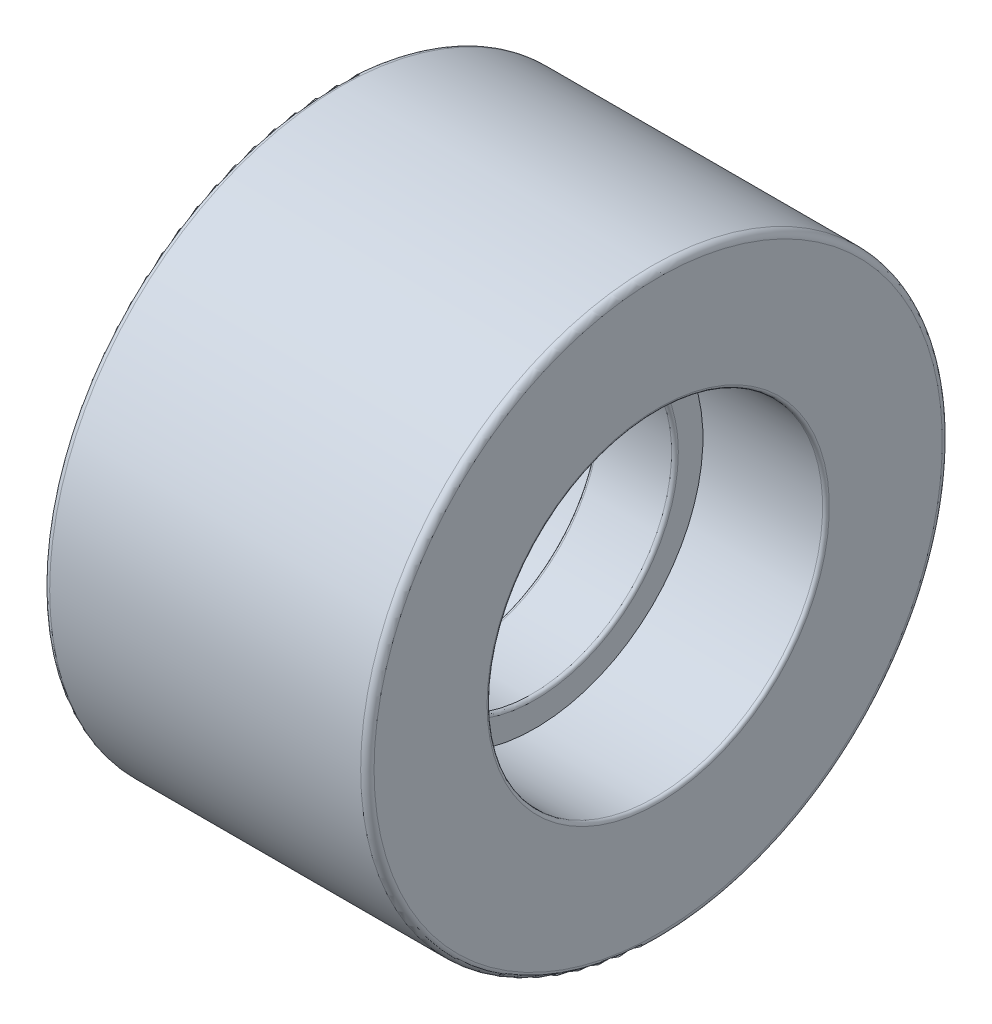
ISO-10303-21;
HEADER;
FILE_DESCRIPTION(('STEP AP214'),'2;1');
FILE_NAME('part.step','',(''),(''),'','','');
FILE_SCHEMA(('AUTOMOTIVE_DESIGN { 1 0 10303 214 1 1 1 1 }'));
ENDSEC;
DATA;
#1=APPLICATION_CONTEXT('core data for automotive mechanical design processes');
#2=APPLICATION_PROTOCOL_DEFINITION('international standard','automotive_design',2000,#1);
#3=PRODUCT_CONTEXT('',#1,'mechanical');
#4=PRODUCT('Part','Part','',(#3));
#5=PRODUCT_RELATED_PRODUCT_CATEGORY('part','',(#4));
#6=PRODUCT_DEFINITION_FORMATION('','',#4);
#7=PRODUCT_DEFINITION_CONTEXT('part definition',#1,'design');
#8=PRODUCT_DEFINITION('design','',#6,#7);
#9=PRODUCT_DEFINITION_SHAPE('','',#8);
#10=(LENGTH_UNIT() NAMED_UNIT(*) SI_UNIT(.MILLI.,.METRE.));
#11=(NAMED_UNIT(*) PLANE_ANGLE_UNIT() SI_UNIT($,.RADIAN.));
#12=(NAMED_UNIT(*) SI_UNIT($,.STERADIAN.) SOLID_ANGLE_UNIT());
#13=UNCERTAINTY_MEASURE_WITH_UNIT(LENGTH_MEASURE(1.E-05),#10,'distance_accuracy_value','');
#14=(GEOMETRIC_REPRESENTATION_CONTEXT(3) GLOBAL_UNCERTAINTY_ASSIGNED_CONTEXT((#13)) GLOBAL_UNIT_ASSIGNED_CONTEXT((#10,
#11,#12)) REPRESENTATION_CONTEXT('',''));
#15=CARTESIAN_POINT('',(0.,0.,0.));
#16=DIRECTION('',(0.,0.,1.));
#17=DIRECTION('',(1.,0.,0.));
#18=AXIS2_PLACEMENT_3D('',#15,#16,#17);
#19=CARTESIAN_POINT('',(0.,15.3,0.));
#20=DIRECTION('',(-1.,0.,0.));
#21=DIRECTION('',(0.,0.,1.));
#22=AXIS2_PLACEMENT_3D('',#19,#20,#21);
#23=PLANE('',#22);
#24=CARTESIAN_POINT('',(0.,0.,0.));
#25=DIRECTION('',(-1.,0.,0.));
#26=DIRECTION('',(0.,0.,1.));
#27=AXIS2_PLACEMENT_3D('',#24,#25,#26);
#28=CIRCLE('',#27,25.4);
#29=CARTESIAN_POINT('',(0.,0.,25.4));
#30=VERTEX_POINT('',#29);
#31=EDGE_CURVE('E127',#30,#30,#28,.T.);
#32=ORIENTED_EDGE('',*,*,#31,.T.);
#33=EDGE_LOOP('',(#32));
#34=FACE_BOUND('',#33,.T.);
#35=CARTESIAN_POINT('',(0.,0.,0.));
#36=DIRECTION('',(-1.,0.,0.));
#37=DIRECTION('',(0.,0.,1.));
#38=AXIS2_PLACEMENT_3D('',#35,#36,#37);
#39=CIRCLE('',#38,15.3);
#40=CARTESIAN_POINT('',(0.,0.,15.3));
#41=VERTEX_POINT('',#40);
#42=EDGE_CURVE('E10',#41,#41,#39,.T.);
#43=ORIENTED_EDGE('',*,*,#42,.F.);
#44=EDGE_LOOP('',(#43));
#45=FACE_BOUND('',#44,.T.);
#46=ADVANCED_FACE('F15',(#34,#45),#23,.T.);
#47=CARTESIAN_POINT('',(0.3,0.,0.));
#48=DIRECTION('',(-1.,0.,0.));
#49=DIRECTION('',(0.,0.,1.));
#50=AXIS2_PLACEMENT_3D('',#47,#48,#49);
#51=TOROIDAL_SURFACE('',#50,15.3,0.3);
#52=CARTESIAN_POINT('',(0.3,0.,0.));
#53=DIRECTION('',(-1.,0.,0.));
#54=DIRECTION('',(0.,0.,1.));
#55=AXIS2_PLACEMENT_3D('',#52,#53,#54);
#56=CIRCLE('',#55,15.);
#57=CARTESIAN_POINT('',(0.3,0.,15.));
#58=VERTEX_POINT('',#57);
#59=EDGE_CURVE('E24',#58,#58,#56,.T.);
#60=ORIENTED_EDGE('',*,*,#59,.F.);
#61=EDGE_LOOP('',(#60));
#62=FACE_BOUND('',#61,.T.);
#63=ORIENTED_EDGE('',*,*,#42,.T.);
#64=EDGE_LOOP('',(#63));
#65=FACE_BOUND('',#64,.T.);
#66=ADVANCED_FACE('F180',(#62,#65),#51,.T.);
#67=CARTESIAN_POINT('',(0.3,0.,0.));
#68=DIRECTION('',(-1.,0.,0.));
#69=DIRECTION('',(0.,0.,1.));
#70=AXIS2_PLACEMENT_3D('',#67,#68,#69);
#71=CYLINDRICAL_SURFACE('',#70,15.);
#72=CARTESIAN_POINT('',(11.,0.,0.));
#73=DIRECTION('',(-1.,0.,0.));
#74=DIRECTION('',(0.,0.,1.));
#75=AXIS2_PLACEMENT_3D('',#72,#73,#74);
#76=CIRCLE('',#75,15.);
#77=CARTESIAN_POINT('',(11.,0.,15.));
#78=VERTEX_POINT('',#77);
#79=EDGE_CURVE('E32',#78,#78,#76,.T.);
#80=ORIENTED_EDGE('',*,*,#79,.F.);
#81=EDGE_LOOP('',(#80));
#82=FACE_BOUND('',#81,.T.);
#83=ORIENTED_EDGE('',*,*,#59,.T.);
#84=EDGE_LOOP('',(#83));
#85=FACE_BOUND('',#84,.T.);
#86=ADVANCED_FACE('F177',(#82,#85),#71,.F.);
#87=CARTESIAN_POINT('',(11.,15.,0.));
#88=DIRECTION('',(1.,0.,0.));
#89=DIRECTION('',(0.,0.,-1.));
#90=AXIS2_PLACEMENT_3D('',#87,#88,#89);
#91=PLANE('',#90);
#92=CARTESIAN_POINT('',(11.,0.,0.));
#93=DIRECTION('',(-1.,0.,0.));
#94=DIRECTION('',(0.,0.,1.));
#95=AXIS2_PLACEMENT_3D('',#92,#93,#94);
#96=CIRCLE('',#95,12.8);
#97=CARTESIAN_POINT('',(11.,0.,12.8));
#98=VERTEX_POINT('',#97);
#99=EDGE_CURVE('E167',#98,#98,#96,.T.);
#100=ORIENTED_EDGE('',*,*,#99,.F.);
#101=EDGE_LOOP('',(#100));
#102=FACE_BOUND('',#101,.T.);
#103=ORIENTED_EDGE('',*,*,#79,.T.);
#104=EDGE_LOOP('',(#103));
#105=FACE_BOUND('',#104,.T.);
#106=ADVANCED_FACE('F175',(#102,#105),#91,.F.);
#107=CARTESIAN_POINT('',(11.3,0.,0.));
#108=DIRECTION('',(-1.,0.,0.));
#109=DIRECTION('',(0.,0.,1.));
#110=AXIS2_PLACEMENT_3D('',#107,#108,#109);
#111=TOROIDAL_SURFACE('',#110,12.8,0.3);
#112=CARTESIAN_POINT('',(11.3,0.,0.));
#113=DIRECTION('',(-1.,0.,0.));
#114=DIRECTION('',(0.,0.,1.));
#115=AXIS2_PLACEMENT_3D('',#112,#113,#114);
#116=CIRCLE('',#115,12.5);
#117=CARTESIAN_POINT('',(11.3,0.,12.5));
#118=VERTEX_POINT('',#117);
#119=EDGE_CURVE('E163',#118,#118,#116,.T.);
#120=ORIENTED_EDGE('',*,*,#119,.F.);
#121=EDGE_LOOP('',(#120));
#122=FACE_BOUND('',#121,.T.);
#123=ORIENTED_EDGE('',*,*,#99,.T.);
#124=EDGE_LOOP('',(#123));
#125=FACE_BOUND('',#124,.T.);
#126=ADVANCED_FACE('F193',(#122,#125),#111,.T.);
#127=CARTESIAN_POINT('',(0.3,0.,0.));
#128=DIRECTION('',(-1.,0.,0.));
#129=DIRECTION('',(0.,0.,1.));
#130=AXIS2_PLACEMENT_3D('',#127,#128,#129);
#131=CYLINDRICAL_SURFACE('',#130,12.5);
#132=CARTESIAN_POINT('',(17.7,0.,0.));
#133=DIRECTION('',(-1.,0.,0.));
#134=DIRECTION('',(0.,0.,1.));
#135=AXIS2_PLACEMENT_3D('',#132,#133,#134);
#136=CIRCLE('',#135,12.5);
#137=CARTESIAN_POINT('',(17.7,0.,12.5));
#138=VERTEX_POINT('',#137);
#139=EDGE_CURVE('E159',#138,#138,#136,.T.);
#140=ORIENTED_EDGE('',*,*,#139,.F.);
#141=EDGE_LOOP('',(#140));
#142=FACE_BOUND('',#141,.T.);
#143=ORIENTED_EDGE('',*,*,#119,.T.);
#144=EDGE_LOOP('',(#143));
#145=FACE_BOUND('',#144,.T.);
#146=ADVANCED_FACE('F197',(#142,#145),#131,.F.);
#147=CARTESIAN_POINT('',(17.7,0.,0.));
#148=DIRECTION('',(-1.,0.,0.));
#149=DIRECTION('',(0.,0.,1.));
#150=AXIS2_PLACEMENT_3D('',#147,#148,#149);
#151=TOROIDAL_SURFACE('',#150,12.8,0.3);
#152=CARTESIAN_POINT('',(18.,0.,0.));
#153=DIRECTION('',(-1.,0.,0.));
#154=DIRECTION('',(0.,0.,1.));
#155=AXIS2_PLACEMENT_3D('',#152,#153,#154);
#156=CIRCLE('',#155,12.8);
#157=CARTESIAN_POINT('',(18.,0.,12.8));
#158=VERTEX_POINT('',#157);
#159=EDGE_CURVE('E155',#158,#158,#156,.T.);
#160=ORIENTED_EDGE('',*,*,#159,.F.);
#161=EDGE_LOOP('',(#160));
#162=FACE_BOUND('',#161,.T.);
#163=ORIENTED_EDGE('',*,*,#139,.T.);
#164=EDGE_LOOP('',(#163));
#165=FACE_BOUND('',#164,.T.);
#166=ADVANCED_FACE('F201',(#162,#165),#151,.T.);
#167=CARTESIAN_POINT('',(18.,12.8,0.));
#168=DIRECTION('',(-1.,0.,0.));
#169=DIRECTION('',(0.,0.,1.));
#170=AXIS2_PLACEMENT_3D('',#167,#168,#169);
#171=PLANE('',#170);
#172=CARTESIAN_POINT('',(18.,0.,0.));
#173=DIRECTION('',(-1.,0.,0.));
#174=DIRECTION('',(0.,0.,1.));
#175=AXIS2_PLACEMENT_3D('',#172,#173,#174);
#176=CIRCLE('',#175,15.);
#177=CARTESIAN_POINT('',(18.,0.,15.));
#178=VERTEX_POINT('',#177);
#179=EDGE_CURVE('E151',#178,#178,#176,.T.);
#180=ORIENTED_EDGE('',*,*,#179,.F.);
#181=EDGE_LOOP('',(#180));
#182=FACE_BOUND('',#181,.T.);
#183=ORIENTED_EDGE('',*,*,#159,.T.);
#184=EDGE_LOOP('',(#183));
#185=FACE_BOUND('',#184,.T.);
#186=ADVANCED_FACE('F205',(#182,#185),#171,.F.);
#187=CARTESIAN_POINT('',(0.3,0.,0.));
#188=DIRECTION('',(-1.,0.,0.));
#189=DIRECTION('',(0.,0.,1.));
#190=AXIS2_PLACEMENT_3D('',#187,#188,#189);
#191=CYLINDRICAL_SURFACE('',#190,15.);
#192=CARTESIAN_POINT('',(28.7,0.,0.));
#193=DIRECTION('',(-1.,0.,0.));
#194=DIRECTION('',(0.,0.,1.));
#195=AXIS2_PLACEMENT_3D('',#192,#193,#194);
#196=CIRCLE('',#195,15.);
#197=CARTESIAN_POINT('',(28.7,0.,15.));
#198=VERTEX_POINT('',#197);
#199=EDGE_CURVE('E147',#198,#198,#196,.T.);
#200=ORIENTED_EDGE('',*,*,#199,.F.);
#201=EDGE_LOOP('',(#200));
#202=FACE_BOUND('',#201,.T.);
#203=ORIENTED_EDGE('',*,*,#179,.T.);
#204=EDGE_LOOP('',(#203));
#205=FACE_BOUND('',#204,.T.);
#206=ADVANCED_FACE('F209',(#202,#205),#191,.F.);
#207=CARTESIAN_POINT('',(28.7,0.,0.));
#208=DIRECTION('',(-1.,0.,0.));
#209=DIRECTION('',(0.,0.,1.));
#210=AXIS2_PLACEMENT_3D('',#207,#208,#209);
#211=TOROIDAL_SURFACE('',#210,15.3,0.3);
#212=CARTESIAN_POINT('',(29.,0.,0.));
#213=DIRECTION('',(-1.,0.,0.));
#214=DIRECTION('',(0.,0.,1.));
#215=AXIS2_PLACEMENT_3D('',#212,#213,#214);
#216=CIRCLE('',#215,15.3);
#217=CARTESIAN_POINT('',(29.,0.,15.3));
#218=VERTEX_POINT('',#217);
#219=EDGE_CURVE('E143',#218,#218,#216,.T.);
#220=ORIENTED_EDGE('',*,*,#219,.F.);
#221=EDGE_LOOP('',(#220));
#222=FACE_BOUND('',#221,.T.);
#223=ORIENTED_EDGE('',*,*,#199,.T.);
#224=EDGE_LOOP('',(#223));
#225=FACE_BOUND('',#224,.T.);
#226=ADVANCED_FACE('F213',(#222,#225),#211,.T.);
#227=CARTESIAN_POINT('',(29.,15.3,0.));
#228=DIRECTION('',(-1.,0.,0.));
#229=DIRECTION('',(0.,0.,1.));
#230=AXIS2_PLACEMENT_3D('',#227,#228,#229);
#231=PLANE('',#230);
#232=CARTESIAN_POINT('',(29.,0.,0.));
#233=DIRECTION('',(-1.,0.,0.));
#234=DIRECTION('',(0.,0.,1.));
#235=AXIS2_PLACEMENT_3D('',#232,#233,#234);
#236=CIRCLE('',#235,25.4);
#237=CARTESIAN_POINT('',(29.,0.,25.4));
#238=VERTEX_POINT('',#237);
#239=EDGE_CURVE('E139',#238,#238,#236,.T.);
#240=ORIENTED_EDGE('',*,*,#239,.F.);
#241=EDGE_LOOP('',(#240));
#242=FACE_BOUND('',#241,.T.);
#243=ORIENTED_EDGE('',*,*,#219,.T.);
#244=EDGE_LOOP('',(#243));
#245=FACE_BOUND('',#244,.T.);
#246=ADVANCED_FACE('F217',(#242,#245),#231,.F.);
#247=CARTESIAN_POINT('',(28.4,0.,0.));
#248=DIRECTION('',(-1.,0.,0.));
#249=DIRECTION('',(0.,0.,1.));
#250=AXIS2_PLACEMENT_3D('',#247,#248,#249);
#251=TOROIDAL_SURFACE('',#250,25.4,0.6);
#252=CARTESIAN_POINT('',(28.4,0.,0.));
#253=DIRECTION('',(-1.,0.,0.));
#254=DIRECTION('',(0.,0.,1.));
#255=AXIS2_PLACEMENT_3D('',#252,#253,#254);
#256=CIRCLE('',#255,26.);
#257=CARTESIAN_POINT('',(28.4,0.,26.));
#258=VERTEX_POINT('',#257);
#259=EDGE_CURVE('E135',#258,#258,#256,.T.);
#260=ORIENTED_EDGE('',*,*,#259,.F.);
#261=EDGE_LOOP('',(#260));
#262=FACE_BOUND('',#261,.T.);
#263=ORIENTED_EDGE('',*,*,#239,.T.);
#264=EDGE_LOOP('',(#263));
#265=FACE_BOUND('',#264,.T.);
#266=ADVANCED_FACE('F221',(#262,#265),#251,.T.);
#267=CARTESIAN_POINT('',(0.3,0.,0.));
#268=DIRECTION('',(-1.,0.,0.));
#269=DIRECTION('',(0.,0.,1.));
#270=AXIS2_PLACEMENT_3D('',#267,#268,#269);
#271=CYLINDRICAL_SURFACE('',#270,26.);
#272=ORIENTED_EDGE('',*,*,#259,.T.);
#273=EDGE_LOOP('',(#272));
#274=FACE_BOUND('',#273,.T.);
#275=CARTESIAN_POINT('',(0.6,0.,0.));
#276=DIRECTION('',(-1.,0.,0.));
#277=DIRECTION('',(0.,0.,1.));
#278=AXIS2_PLACEMENT_3D('',#275,#276,#277);
#279=CIRCLE('',#278,26.);
#280=CARTESIAN_POINT('',(0.6,0.,26.));
#281=VERTEX_POINT('',#280);
#282=EDGE_CURVE('E131',#281,#281,#279,.T.);
#283=ORIENTED_EDGE('',*,*,#282,.F.);
#284=EDGE_LOOP('',(#283));
#285=FACE_BOUND('',#284,.T.);
#286=ADVANCED_FACE('F225',(#274,#285),#271,.T.);
#287=CARTESIAN_POINT('',(0.6,0.,0.));
#288=DIRECTION('',(-1.,0.,0.));
#289=DIRECTION('',(0.,0.,1.));
#290=AXIS2_PLACEMENT_3D('',#287,#288,#289);
#291=TOROIDAL_SURFACE('',#290,25.4,0.6);
#292=ORIENTED_EDGE('',*,*,#31,.F.);
#293=EDGE_LOOP('',(#292));
#294=FACE_BOUND('',#293,.T.);
#295=ORIENTED_EDGE('',*,*,#282,.T.);
#296=EDGE_LOOP('',(#295));
#297=FACE_BOUND('',#296,.T.);
#298=ADVANCED_FACE('F229',(#294,#297),#291,.T.);
#299=CLOSED_SHELL('',(#46,#66,#86,#106,#126,#146,#166,#186,#206,#226,#246,#266,#286,#298));
#300=CARTESIAN_POINT('',(5.852,0.,0.));
#301=DIRECTION('',(-1.,0.,0.));
#302=DIRECTION('',(0.,0.,-1.));
#303=AXIS2_PLACEMENT_3D('',#300,#301,#302);
#304=CYLINDRICAL_SURFACE('',#303,20.23);
#305=CARTESIAN_POINT('',(7.562,0.,0.));
#306=DIRECTION('',(-1.,0.,0.));
#307=DIRECTION('',(0.,-1.,0.));
#308=AXIS2_PLACEMENT_3D('',#305,#306,#307);
#309=CIRCLE('',#308,20.23);
#310=CARTESIAN_POINT('',(7.562,-20.23,0.));
#311=VERTEX_POINT('',#310);
#312=EDGE_CURVE('E45',#311,#311,#309,.T.);
#313=ORIENTED_EDGE('',*,*,#312,.T.);
#314=EDGE_LOOP('',(#313));
#315=FACE_BOUND('',#314,.T.);
#316=CARTESIAN_POINT('',(5.852,0.,0.));
#317=DIRECTION('',(-1.,0.,0.));
#318=DIRECTION('',(0.,0.,-1.));
#319=AXIS2_PLACEMENT_3D('',#316,#317,#318);
#320=CIRCLE('',#319,20.23);
#321=CARTESIAN_POINT('',(5.852,0.,-20.23));
#322=VERTEX_POINT('',#321);
#323=EDGE_CURVE('E123',#322,#322,#320,.T.);
#324=ORIENTED_EDGE('',*,*,#323,.F.);
#325=EDGE_LOOP('',(#324));
#326=FACE_BOUND('',#325,.T.);
#327=ADVANCED_FACE('F240',(#315,#326),#304,.T.);
#328=CARTESIAN_POINT('',(5.852,0.,0.));
#329=DIRECTION('',(-1.,0.,0.));
#330=DIRECTION('',(0.,0.,-1.));
#331=AXIS2_PLACEMENT_3D('',#328,#329,#330);
#332=CYLINDRICAL_SURFACE('',#331,20.77);
#333=CARTESIAN_POINT('',(7.562,0.,0.));
#334=DIRECTION('',(-1.,0.,0.));
#335=DIRECTION('',(0.,-1.,0.));
#336=AXIS2_PLACEMENT_3D('',#333,#334,#335);
#337=CIRCLE('',#336,20.77);
#338=CARTESIAN_POINT('',(7.562,-20.77,0.));
#339=VERTEX_POINT('',#338);
#340=EDGE_CURVE('E42',#339,#339,#337,.F.);
#341=ORIENTED_EDGE('',*,*,#340,.T.);
#342=EDGE_LOOP('',(#341));
#343=FACE_BOUND('',#342,.T.);
#344=CARTESIAN_POINT('',(5.852,0.,0.));
#345=DIRECTION('',(-1.,0.,0.));
#346=DIRECTION('',(0.,0.,-1.));
#347=AXIS2_PLACEMENT_3D('',#344,#345,#346);
#348=CIRCLE('',#347,20.77);
#349=CARTESIAN_POINT('',(5.852,0.,-20.77));
#350=VERTEX_POINT('',#349);
#351=EDGE_CURVE('E119',#350,#350,#348,.T.);
#352=ORIENTED_EDGE('',*,*,#351,.T.);
#353=EDGE_LOOP('',(#352));
#354=FACE_BOUND('',#353,.T.);
#355=ADVANCED_FACE('F246',(#343,#354),#332,.F.);
#356=CARTESIAN_POINT('',(5.852,-20.23,0.));
#357=DIRECTION('',(-1.,0.,0.));
#358=DIRECTION('',(0.,0.,-1.));
#359=AXIS2_PLACEMENT_3D('',#356,#357,#358);
#360=PLANE('',#359);
#361=ORIENTED_EDGE('',*,*,#351,.F.);
#362=EDGE_LOOP('',(#361));
#363=FACE_BOUND('',#362,.T.);
#364=ORIENTED_EDGE('',*,*,#323,.T.);
#365=EDGE_LOOP('',(#364));
#366=FACE_BOUND('',#365,.T.);
#367=ADVANCED_FACE('F242',(#363,#366),#360,.F.);
#368=CARTESIAN_POINT('',(7.562,-16.54,0.));
#369=DIRECTION('',(-1.,0.,0.));
#370=DIRECTION('',(0.,0.,-1.));
#371=AXIS2_PLACEMENT_3D('',#368,#369,#370);
#372=PLANE('',#371);
#373=CARTESIAN_POINT('',(7.562,0.,0.));
#374=DIRECTION('',(-1.,0.,0.));
#375=DIRECTION('',(0.,0.,-1.));
#376=AXIS2_PLACEMENT_3D('',#373,#374,#375);
#377=CIRCLE('',#376,24.46);
#378=CARTESIAN_POINT('',(7.562,0.,-24.46));
#379=VERTEX_POINT('',#378);
#380=EDGE_CURVE('E82',#379,#379,#377,.T.);
#381=ORIENTED_EDGE('',*,*,#380,.F.);
#382=EDGE_LOOP('',(#381));
#383=FACE_BOUND('',#382,.T.);
#384=ORIENTED_EDGE('',*,*,#340,.F.);
#385=EDGE_LOOP('',(#384));
#386=FACE_BOUND('',#385,.T.);
#387=ADVANCED_FACE('F245',(#383,#386),#372,.F.);
#388=CARTESIAN_POINT('',(7.562,0.,0.));
#389=DIRECTION('',(-1.,0.,0.));
#390=DIRECTION('',(0.,0.,-1.));
#391=AXIS2_PLACEMENT_3D('',#388,#389,#390);
#392=CYLINDRICAL_SURFACE('',#391,24.46);
#393=CARTESIAN_POINT('',(8.102,0.,0.));
#394=DIRECTION('',(-1.,0.,0.));
#395=DIRECTION('',(0.,0.,-1.));
#396=AXIS2_PLACEMENT_3D('',#393,#394,#395);
#397=CIRCLE('',#396,24.46);
#398=CARTESIAN_POINT('',(8.102,0.,-24.46));
#399=VERTEX_POINT('',#398);
#400=EDGE_CURVE('E78',#399,#399,#397,.T.);
#401=ORIENTED_EDGE('',*,*,#400,.F.);
#402=EDGE_LOOP('',(#401));
#403=FACE_BOUND('',#402,.T.);
#404=ORIENTED_EDGE('',*,*,#380,.T.);
#405=EDGE_LOOP('',(#404));
#406=FACE_BOUND('',#405,.T.);
#407=ADVANCED_FACE('F285',(#403,#406),#392,.F.);
#408=CARTESIAN_POINT('',(8.102,-24.46,0.));
#409=DIRECTION('',(1.,0.,0.));
#410=DIRECTION('',(0.,0.,1.));
#411=AXIS2_PLACEMENT_3D('',#408,#409,#410);
#412=PLANE('',#411);
#413=ORIENTED_EDGE('',*,*,#400,.T.);
#414=EDGE_LOOP('',(#413));
#415=FACE_BOUND('',#414,.T.);
#416=CARTESIAN_POINT('',(8.102,0.,0.));
#417=DIRECTION('',(1.,0.,0.));
#418=DIRECTION('',(0.,1.,0.));
#419=AXIS2_PLACEMENT_3D('',#416,#417,#418);
#420=CIRCLE('',#419,20.77);
#421=CARTESIAN_POINT('',(8.102,20.77,0.));
#422=VERTEX_POINT('',#421);
#423=EDGE_CURVE('E36',#422,#422,#420,.F.);
#424=ORIENTED_EDGE('',*,*,#423,.F.);
#425=EDGE_LOOP('',(#424));
#426=FACE_BOUND('',#425,.T.);
#427=ADVANCED_FACE('F283',(#415,#426),#412,.F.);
#428=CARTESIAN_POINT('',(7.562,0.,0.));
#429=DIRECTION('',(-1.,0.,0.));
#430=DIRECTION('',(0.,0.,-1.));
#431=AXIS2_PLACEMENT_3D('',#428,#429,#430);
#432=CIRCLE('',#431,16.54);
#433=CARTESIAN_POINT('',(7.562,0.,-16.54));
#434=VERTEX_POINT('',#433);
#435=EDGE_CURVE('E41',#434,#434,#432,.T.);
#436=ORIENTED_EDGE('',*,*,#435,.T.);
#437=EDGE_LOOP('',(#436));
#438=FACE_BOUND('',#437,.T.);
#439=ORIENTED_EDGE('',*,*,#312,.F.);
#440=EDGE_LOOP('',(#439));
#441=FACE_BOUND('',#440,.T.);
#442=ADVANCED_FACE('F280',(#438,#441),#372,.F.);
#443=CARTESIAN_POINT('',(8.102,0.,0.));
#444=DIRECTION('',(-1.,0.,0.));
#445=DIRECTION('',(0.,0.,-1.));
#446=AXIS2_PLACEMENT_3D('',#443,#444,#445);
#447=CIRCLE('',#446,16.54);
#448=CARTESIAN_POINT('',(8.102,0.,-16.54));
#449=VERTEX_POINT('',#448);
#450=EDGE_CURVE('E74',#449,#449,#447,.T.);
#451=ORIENTED_EDGE('',*,*,#450,.F.);
#452=EDGE_LOOP('',(#451));
#453=FACE_BOUND('',#452,.T.);
#454=CARTESIAN_POINT('',(8.102,0.,0.));
#455=DIRECTION('',(1.,0.,0.));
#456=DIRECTION('',(0.,1.,0.));
#457=AXIS2_PLACEMENT_3D('',#454,#455,#456);
#458=CIRCLE('',#457,20.23);
#459=CARTESIAN_POINT('',(8.102,20.23,0.));
#460=VERTEX_POINT('',#459);
#461=EDGE_CURVE('E40',#460,#460,#458,.T.);
#462=ORIENTED_EDGE('',*,*,#461,.F.);
#463=EDGE_LOOP('',(#462));
#464=FACE_BOUND('',#463,.T.);
#465=ADVANCED_FACE('F278',(#453,#464),#412,.F.);
#466=CARTESIAN_POINT('',(7.562,0.,0.));
#467=DIRECTION('',(-1.,0.,0.));
#468=DIRECTION('',(0.,0.,-1.));
#469=AXIS2_PLACEMENT_3D('',#466,#467,#468);
#470=CYLINDRICAL_SURFACE('',#469,16.54);
#471=ORIENTED_EDGE('',*,*,#435,.F.);
#472=EDGE_LOOP('',(#471));
#473=FACE_BOUND('',#472,.T.);
#474=ORIENTED_EDGE('',*,*,#450,.T.);
#475=EDGE_LOOP('',(#474));
#476=FACE_BOUND('',#475,.T.);
#477=ADVANCED_FACE('F238',(#473,#476),#470,.T.);
#478=ORIENTED_EDGE('',*,*,#461,.T.);
#479=EDGE_LOOP('',(#478));
#480=FACE_BOUND('',#479,.T.);
#481=CARTESIAN_POINT('',(9.812,0.,0.));
#482=DIRECTION('',(-1.,0.,0.));
#483=DIRECTION('',(0.,0.,-1.));
#484=AXIS2_PLACEMENT_3D('',#481,#482,#483);
#485=CIRCLE('',#484,20.23);
#486=CARTESIAN_POINT('',(9.812,0.,-20.23));
#487=VERTEX_POINT('',#486);
#488=EDGE_CURVE('E111',#487,#487,#485,.T.);
#489=ORIENTED_EDGE('',*,*,#488,.T.);
#490=EDGE_LOOP('',(#489));
#491=FACE_BOUND('',#490,.T.);
#492=ADVANCED_FACE('F234',(#480,#491),#304,.T.);
#493=CARTESIAN_POINT('',(9.812,-20.77,0.));
#494=DIRECTION('',(1.,0.,0.));
#495=DIRECTION('',(0.,0.,1.));
#496=AXIS2_PLACEMENT_3D('',#493,#494,#495);
#497=PLANE('',#496);
#498=ORIENTED_EDGE('',*,*,#488,.F.);
#499=EDGE_LOOP('',(#498));
#500=FACE_BOUND('',#499,.T.);
#501=CARTESIAN_POINT('',(9.812,0.,0.));
#502=DIRECTION('',(-1.,0.,0.));
#503=DIRECTION('',(0.,0.,-1.));
#504=AXIS2_PLACEMENT_3D('',#501,#502,#503);
#505=CIRCLE('',#504,20.77);
#506=CARTESIAN_POINT('',(9.812,0.,-20.77));
#507=VERTEX_POINT('',#506);
#508=EDGE_CURVE('E115',#507,#507,#505,.T.);
#509=ORIENTED_EDGE('',*,*,#508,.T.);
#510=EDGE_LOOP('',(#509));
#511=FACE_BOUND('',#510,.T.);
#512=ADVANCED_FACE('F237',(#500,#511),#497,.F.);
#513=ORIENTED_EDGE('',*,*,#423,.T.);
#514=EDGE_LOOP('',(#513));
#515=FACE_BOUND('',#514,.T.);
#516=ORIENTED_EDGE('',*,*,#508,.F.);
#517=EDGE_LOOP('',(#516));
#518=FACE_BOUND('',#517,.T.);
#519=ADVANCED_FACE('F248',(#515,#518),#332,.F.);
#520=CLOSED_SHELL('',(#327,#355,#367,#387,#407,#427,#442,#465,#477,#492,#512,#519));
#521=CARTESIAN_POINT('',(19.188,0.,0.));
#522=DIRECTION('',(-1.,0.,0.));
#523=DIRECTION('',(0.,0.,-1.));
#524=AXIS2_PLACEMENT_3D('',#521,#522,#523);
#525=CYLINDRICAL_SURFACE('',#524,20.23);
#526=CARTESIAN_POINT('',(20.898,0.,0.));
#527=DIRECTION('',(-1.,0.,0.));
#528=DIRECTION('',(0.,-1.,0.));
#529=AXIS2_PLACEMENT_3D('',#526,#527,#528);
#530=CIRCLE('',#529,20.23);
#531=CARTESIAN_POINT('',(20.898,-20.23,0.));
#532=VERTEX_POINT('',#531);
#533=EDGE_CURVE('E70',#532,#532,#530,.T.);
#534=ORIENTED_EDGE('',*,*,#533,.T.);
#535=EDGE_LOOP('',(#534));
#536=FACE_BOUND('',#535,.T.);
#537=CARTESIAN_POINT('',(19.188,0.,0.));
#538=DIRECTION('',(-1.,0.,0.));
#539=DIRECTION('',(0.,0.,-1.));
#540=AXIS2_PLACEMENT_3D('',#537,#538,#539);
#541=CIRCLE('',#540,20.23);
#542=CARTESIAN_POINT('',(19.188,0.,-20.23));
#543=VERTEX_POINT('',#542);
#544=EDGE_CURVE('E107',#543,#543,#541,.T.);
#545=ORIENTED_EDGE('',*,*,#544,.F.);
#546=EDGE_LOOP('',(#545));
#547=FACE_BOUND('',#546,.T.);
#548=ADVANCED_FACE('F262',(#536,#547),#525,.T.);
#549=CARTESIAN_POINT('',(19.188,0.,0.));
#550=DIRECTION('',(-1.,0.,0.));
#551=DIRECTION('',(0.,0.,-1.));
#552=AXIS2_PLACEMENT_3D('',#549,#550,#551);
#553=CYLINDRICAL_SURFACE('',#552,20.77);
#554=CARTESIAN_POINT('',(20.898,0.,0.));
#555=DIRECTION('',(-1.,0.,0.));
#556=DIRECTION('',(0.,-1.,0.));
#557=AXIS2_PLACEMENT_3D('',#554,#555,#556);
#558=CIRCLE('',#557,20.77);
#559=CARTESIAN_POINT('',(20.898,-20.77,0.));
#560=VERTEX_POINT('',#559);
#561=EDGE_CURVE('E18',#560,#560,#558,.F.);
#562=ORIENTED_EDGE('',*,*,#561,.T.);
#563=EDGE_LOOP('',(#562));
#564=FACE_BOUND('',#563,.T.);
#565=CARTESIAN_POINT('',(19.188,0.,0.));
#566=DIRECTION('',(-1.,0.,0.));
#567=DIRECTION('',(0.,0.,-1.));
#568=AXIS2_PLACEMENT_3D('',#565,#566,#567);
#569=CIRCLE('',#568,20.77);
#570=CARTESIAN_POINT('',(19.188,0.,-20.77));
#571=VERTEX_POINT('',#570);
#572=EDGE_CURVE('E103',#571,#571,#569,.T.);
#573=ORIENTED_EDGE('',*,*,#572,.T.);
#574=EDGE_LOOP('',(#573));
#575=FACE_BOUND('',#574,.T.);
#576=ADVANCED_FACE('F268',(#564,#575),#553,.F.);
#577=CARTESIAN_POINT('',(19.188,-20.23,0.));
#578=DIRECTION('',(-1.,0.,0.));
#579=DIRECTION('',(0.,0.,-1.));
#580=AXIS2_PLACEMENT_3D('',#577,#578,#579);
#581=PLANE('',#580);
#582=ORIENTED_EDGE('',*,*,#572,.F.);
#583=EDGE_LOOP('',(#582));
#584=FACE_BOUND('',#583,.T.);
#585=ORIENTED_EDGE('',*,*,#544,.T.);
#586=EDGE_LOOP('',(#585));
#587=FACE_BOUND('',#586,.T.);
#588=ADVANCED_FACE('F264',(#584,#587),#581,.F.);
#589=CARTESIAN_POINT('',(20.898,-16.54,0.));
#590=DIRECTION('',(-1.,0.,0.));
#591=DIRECTION('',(0.,0.,-1.));
#592=AXIS2_PLACEMENT_3D('',#589,#590,#591);
#593=PLANE('',#592);
#594=CARTESIAN_POINT('',(20.898,0.,0.));
#595=DIRECTION('',(-1.,0.,0.));
#596=DIRECTION('',(0.,0.,-1.));
#597=AXIS2_PLACEMENT_3D('',#594,#595,#596);
#598=CIRCLE('',#597,24.46);
#599=CARTESIAN_POINT('',(20.898,0.,-24.46));
#600=VERTEX_POINT('',#599);
#601=EDGE_CURVE('E59',#600,#600,#598,.T.);
#602=ORIENTED_EDGE('',*,*,#601,.F.);
#603=EDGE_LOOP('',(#602));
#604=FACE_BOUND('',#603,.T.);
#605=ORIENTED_EDGE('',*,*,#561,.F.);
#606=EDGE_LOOP('',(#605));
#607=FACE_BOUND('',#606,.T.);
#608=ADVANCED_FACE('F267',(#604,#607),#593,.F.);
#609=CARTESIAN_POINT('',(20.898,0.,0.));
#610=DIRECTION('',(-1.,0.,0.));
#611=DIRECTION('',(0.,0.,-1.));
#612=AXIS2_PLACEMENT_3D('',#609,#610,#611);
#613=CYLINDRICAL_SURFACE('',#612,24.46);
#614=CARTESIAN_POINT('',(21.438,0.,0.));
#615=DIRECTION('',(-1.,0.,0.));
#616=DIRECTION('',(0.,0.,-1.));
#617=AXIS2_PLACEMENT_3D('',#614,#615,#616);
#618=CIRCLE('',#617,24.46);
#619=CARTESIAN_POINT('',(21.438,0.,-24.46));
#620=VERTEX_POINT('',#619);
#621=EDGE_CURVE('E66',#620,#620,#618,.T.);
#622=ORIENTED_EDGE('',*,*,#621,.F.);
#623=EDGE_LOOP('',(#622));
#624=FACE_BOUND('',#623,.T.);
#625=ORIENTED_EDGE('',*,*,#601,.T.);
#626=EDGE_LOOP('',(#625));
#627=FACE_BOUND('',#626,.T.);
#628=ADVANCED_FACE('F300',(#624,#627),#613,.F.);
#629=CARTESIAN_POINT('',(21.438,-24.46,0.));
#630=DIRECTION('',(1.,0.,0.));
#631=DIRECTION('',(0.,0.,1.));
#632=AXIS2_PLACEMENT_3D('',#629,#630,#631);
#633=PLANE('',#632);
#634=ORIENTED_EDGE('',*,*,#621,.T.);
#635=EDGE_LOOP('',(#634));
#636=FACE_BOUND('',#635,.T.);
#637=CARTESIAN_POINT('',(21.438,0.,0.));
#638=DIRECTION('',(1.,0.,0.));
#639=DIRECTION('',(0.,1.,0.));
#640=AXIS2_PLACEMENT_3D('',#637,#638,#639);
#641=CIRCLE('',#640,20.77);
#642=CARTESIAN_POINT('',(21.438,20.77,0.));
#643=VERTEX_POINT('',#642);
#644=EDGE_CURVE('E46',#643,#643,#641,.F.);
#645=ORIENTED_EDGE('',*,*,#644,.F.);
#646=EDGE_LOOP('',(#645));
#647=FACE_BOUND('',#646,.T.);
#648=ADVANCED_FACE('F299',(#636,#647),#633,.F.);
#649=CARTESIAN_POINT('',(20.898,0.,0.));
#650=DIRECTION('',(-1.,0.,0.));
#651=DIRECTION('',(0.,0.,-1.));
#652=AXIS2_PLACEMENT_3D('',#649,#650,#651);
#653=CIRCLE('',#652,16.54);
#654=CARTESIAN_POINT('',(20.898,0.,-16.54));
#655=VERTEX_POINT('',#654);
#656=EDGE_CURVE('E50',#655,#655,#653,.T.);
#657=ORIENTED_EDGE('',*,*,#656,.T.);
#658=EDGE_LOOP('',(#657));
#659=FACE_BOUND('',#658,.T.);
#660=ORIENTED_EDGE('',*,*,#533,.F.);
#661=EDGE_LOOP('',(#660));
#662=FACE_BOUND('',#661,.T.);
#663=ADVANCED_FACE('F296',(#659,#662),#593,.F.);
#664=CARTESIAN_POINT('',(21.438,0.,0.));
#665=DIRECTION('',(-1.,0.,0.));
#666=DIRECTION('',(0.,0.,-1.));
#667=AXIS2_PLACEMENT_3D('',#664,#665,#666);
#668=CIRCLE('',#667,16.54);
#669=CARTESIAN_POINT('',(21.438,0.,-16.54));
#670=VERTEX_POINT('',#669);
#671=EDGE_CURVE('E346',#670,#670,#668,.T.);
#672=ORIENTED_EDGE('',*,*,#671,.F.);
#673=EDGE_LOOP('',(#672));
#674=FACE_BOUND('',#673,.T.);
#675=CARTESIAN_POINT('',(21.438,0.,0.));
#676=DIRECTION('',(1.,0.,0.));
#677=DIRECTION('',(0.,1.,0.));
#678=AXIS2_PLACEMENT_3D('',#675,#676,#677);
#679=CIRCLE('',#678,20.23);
#680=CARTESIAN_POINT('',(21.438,20.23,0.));
#681=VERTEX_POINT('',#680);
#682=EDGE_CURVE('E49',#681,#681,#679,.T.);
#683=ORIENTED_EDGE('',*,*,#682,.F.);
#684=EDGE_LOOP('',(#683));
#685=FACE_BOUND('',#684,.T.);
#686=ADVANCED_FACE('F294',(#674,#685),#633,.F.);
#687=CARTESIAN_POINT('',(20.898,0.,0.));
#688=DIRECTION('',(-1.,0.,0.));
#689=DIRECTION('',(0.,0.,-1.));
#690=AXIS2_PLACEMENT_3D('',#687,#688,#689);
#691=CYLINDRICAL_SURFACE('',#690,16.54);
#692=ORIENTED_EDGE('',*,*,#656,.F.);
#693=EDGE_LOOP('',(#692));
#694=FACE_BOUND('',#693,.T.);
#695=ORIENTED_EDGE('',*,*,#671,.T.);
#696=EDGE_LOOP('',(#695));
#697=FACE_BOUND('',#696,.T.);
#698=ADVANCED_FACE('F259',(#694,#697),#691,.T.);
#699=ORIENTED_EDGE('',*,*,#682,.T.);
#700=EDGE_LOOP('',(#699));
#701=FACE_BOUND('',#700,.T.);
#702=CARTESIAN_POINT('',(23.148,0.,0.));
#703=DIRECTION('',(-1.,0.,0.));
#704=DIRECTION('',(0.,0.,-1.));
#705=AXIS2_PLACEMENT_3D('',#702,#703,#704);
#706=CIRCLE('',#705,20.23);
#707=CARTESIAN_POINT('',(23.148,0.,-20.23));
#708=VERTEX_POINT('',#707);
#709=EDGE_CURVE('E95',#708,#708,#706,.T.);
#710=ORIENTED_EDGE('',*,*,#709,.T.);
#711=EDGE_LOOP('',(#710));
#712=FACE_BOUND('',#711,.T.);
#713=ADVANCED_FACE('F255',(#701,#712),#525,.T.);
#714=CARTESIAN_POINT('',(23.148,-20.77,0.));
#715=DIRECTION('',(1.,0.,0.));
#716=DIRECTION('',(0.,0.,1.));
#717=AXIS2_PLACEMENT_3D('',#714,#715,#716);
#718=PLANE('',#717);
#719=ORIENTED_EDGE('',*,*,#709,.F.);
#720=EDGE_LOOP('',(#719));
#721=FACE_BOUND('',#720,.T.);
#722=CARTESIAN_POINT('',(23.148,0.,0.));
#723=DIRECTION('',(-1.,0.,0.));
#724=DIRECTION('',(0.,0.,-1.));
#725=AXIS2_PLACEMENT_3D('',#722,#723,#724);
#726=CIRCLE('',#725,20.77);
#727=CARTESIAN_POINT('',(23.148,0.,-20.77));
#728=VERTEX_POINT('',#727);
#729=EDGE_CURVE('E99',#728,#728,#726,.T.);
#730=ORIENTED_EDGE('',*,*,#729,.T.);
#731=EDGE_LOOP('',(#730));
#732=FACE_BOUND('',#731,.T.);
#733=ADVANCED_FACE('F258',(#721,#732),#718,.F.);
#734=ORIENTED_EDGE('',*,*,#644,.T.);
#735=EDGE_LOOP('',(#734));
#736=FACE_BOUND('',#735,.T.);
#737=ORIENTED_EDGE('',*,*,#729,.F.);
#738=EDGE_LOOP('',(#737));
#739=FACE_BOUND('',#738,.T.);
#740=ADVANCED_FACE('F270',(#736,#739),#553,.F.);
#741=CLOSED_SHELL('',(#548,#576,#588,#608,#628,#648,#663,#686,#698,#713,#733,#740));
#742=ORIENTED_CLOSED_SHELL('',*,#520,.T.);
#743=ORIENTED_CLOSED_SHELL('',*,#741,.T.);
#744=BREP_WITH_VOIDS('B1',#299,(#742,#743));
#745=ADVANCED_BREP_SHAPE_REPRESENTATION('',(#18,#744),#14);
#746=SHAPE_DEFINITION_REPRESENTATION(#9,#745);
ENDSEC;
END-ISO-10303-21;
